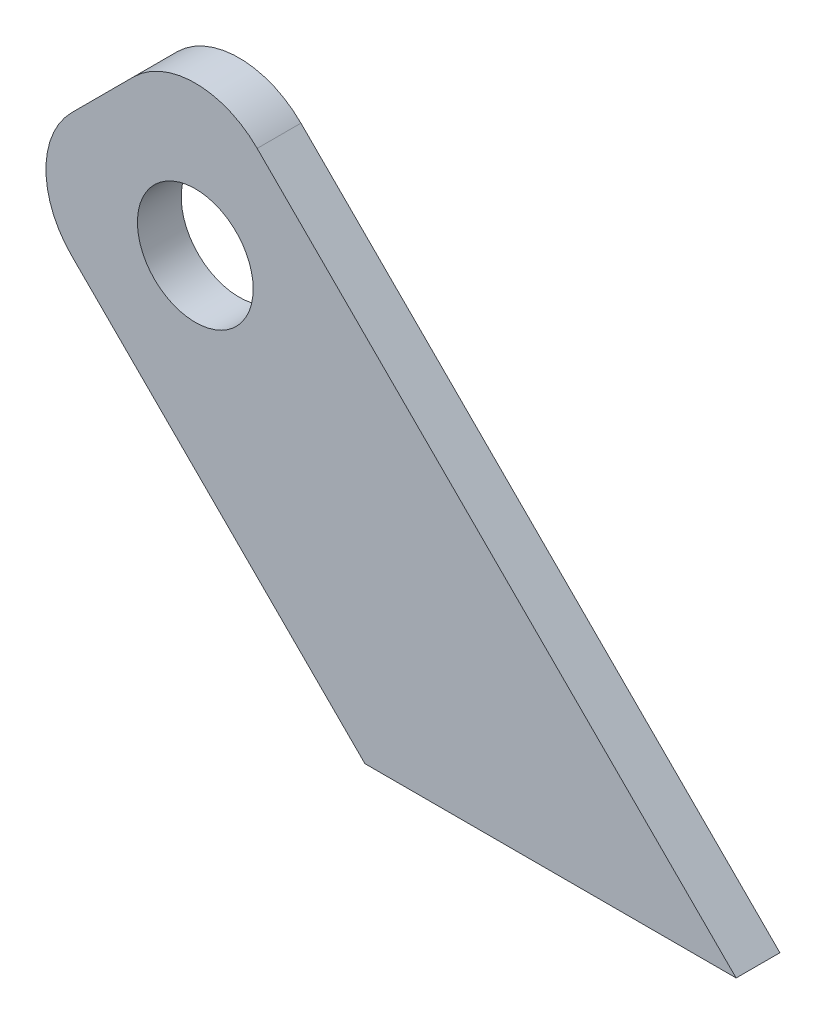
ISO-10303-21;
HEADER;
FILE_DESCRIPTION(('STEP AP214'),'2;1');
FILE_NAME('part.step','',(''),(''),'','','');
FILE_SCHEMA(('AUTOMOTIVE_DESIGN { 1 0 10303 214 1 1 1 1 }'));
ENDSEC;
DATA;
#1=APPLICATION_CONTEXT('core data for automotive mechanical design processes');
#2=APPLICATION_PROTOCOL_DEFINITION('international standard','automotive_design',2000,#1);
#3=PRODUCT_CONTEXT('',#1,'mechanical');
#4=PRODUCT('Part','Part','',(#3));
#5=PRODUCT_RELATED_PRODUCT_CATEGORY('part','',(#4));
#6=PRODUCT_DEFINITION_FORMATION('','',#4);
#7=PRODUCT_DEFINITION_CONTEXT('part definition',#1,'design');
#8=PRODUCT_DEFINITION('design','',#6,#7);
#9=PRODUCT_DEFINITION_SHAPE('','',#8);
#10=(LENGTH_UNIT() NAMED_UNIT(*) SI_UNIT(.MILLI.,.METRE.));
#11=(NAMED_UNIT(*) PLANE_ANGLE_UNIT() SI_UNIT($,.RADIAN.));
#12=(NAMED_UNIT(*) SI_UNIT($,.STERADIAN.) SOLID_ANGLE_UNIT());
#13=UNCERTAINTY_MEASURE_WITH_UNIT(LENGTH_MEASURE(1.E-05),#10,'distance_accuracy_value','');
#14=(GEOMETRIC_REPRESENTATION_CONTEXT(3) GLOBAL_UNCERTAINTY_ASSIGNED_CONTEXT((#13)) GLOBAL_UNIT_ASSIGNED_CONTEXT((#10,
#11,#12)) REPRESENTATION_CONTEXT('',''));
#15=CARTESIAN_POINT('',(0.,0.,0.));
#16=DIRECTION('',(0.,0.,1.));
#17=DIRECTION('',(1.,0.,0.));
#18=AXIS2_PLACEMENT_3D('',#15,#16,#17);
#19=CARTESIAN_POINT('',(33.610044183049,38.0994845362194,-3.175));
#20=DIRECTION('',(0.,0.,1.));
#21=DIRECTION('',(-1.,0.,0.));
#22=AXIS2_PLACEMENT_3D('',#19,#20,#21);
#23=CYLINDRICAL_SURFACE('',#22,6.35);
#24=CARTESIAN_POINT('',(33.610044183049,38.0994845362194,0.));
#25=DIRECTION('',(0.,0.,1.));
#26=DIRECTION('',(1.,0.,0.));
#27=AXIS2_PLACEMENT_3D('',#24,#25,#26);
#28=CIRCLE('',#27,6.35);
#29=CARTESIAN_POINT('',(29.1198730615669,33.6093995370453,0.));
#30=VERTEX_POINT('',#29);
#31=CARTESIAN_POINT('',(29.119959183875,42.5896556577015,0.));
#32=VERTEX_POINT('',#31);
#33=EDGE_CURVE('E137',#30,#32,#28,.F.);
#34=ORIENTED_EDGE('',*,*,#33,.T.);
#35=DIRECTION('',(0.,0.,1.));
#36=VECTOR('',#35,1.);
#37=CARTESIAN_POINT('',(29.119959183875,42.5896556577015,-3.175));
#38=LINE('',#37,#36);
#39=CARTESIAN_POINT('',(29.119959183875,42.5896556577015,-3.175));
#40=VERTEX_POINT('',#39);
#41=EDGE_CURVE('E136',#40,#32,#38,.T.);
#42=ORIENTED_EDGE('',*,*,#41,.F.);
#43=CARTESIAN_POINT('',(33.610044183049,38.0994845362194,-3.175));
#44=DIRECTION('',(0.,0.,1.));
#45=DIRECTION('',(1.,0.,0.));
#46=AXIS2_PLACEMENT_3D('',#43,#44,#45);
#47=CIRCLE('',#46,6.35);
#48=CARTESIAN_POINT('',(29.1198730615669,33.6093995370453,-3.175));
#49=VERTEX_POINT('',#48);
#50=EDGE_CURVE('E155',#49,#40,#47,.F.);
#51=ORIENTED_EDGE('',*,*,#50,.F.);
#52=DIRECTION('',(0.,0.,1.));
#53=VECTOR('',#52,1.);
#54=CARTESIAN_POINT('',(29.1198730615669,33.6093995370453,-3.175));
#55=LINE('',#54,#53);
#56=EDGE_CURVE('E11',#49,#30,#55,.T.);
#57=ORIENTED_EDGE('',*,*,#56,.T.);
#58=EDGE_LOOP('',(#34,#42,#51,#57));
#59=FACE_BOUND('',#58,.T.);
#60=ADVANCED_FACE('F43',(#59),#23,.T.);
#61=CARTESIAN_POINT('',(31.364915561154,31.3643139763043,-3.175));
#62=DIRECTION('',(-0.707113562438127,-0.707099999869934,0.));
#63=DIRECTION('',(0.707099999869934,-0.707113562438127,0.));
#64=AXIS2_PLACEMENT_3D('',#61,#62,#63);
#65=PLANE('',#64);
#66=DIRECTION('',(-0.707099999869934,0.707113562438127,0.));
#67=VECTOR('',#66,1.);
#68=CARTESIAN_POINT('',(31.364915561154,31.3643139763043,0.));
#69=LINE('',#68,#67);
#70=CARTESIAN_POINT('',(40.3449994380201,22.384057856474,0.));
#71=VERTEX_POINT('',#70);
#72=EDGE_CURVE('E140',#71,#30,#69,.T.);
#73=ORIENTED_EDGE('',*,*,#72,.T.);
#74=ORIENTED_EDGE('',*,*,#56,.F.);
#75=DIRECTION('',(-0.707099999869934,0.707113562438127,0.));
#76=VECTOR('',#75,1.);
#77=CARTESIAN_POINT('',(31.364915561154,31.3643139763043,-3.175));
#78=LINE('',#77,#76);
#79=CARTESIAN_POINT('',(40.3449994380201,22.384057856474,-3.175));
#80=VERTEX_POINT('',#79);
#81=EDGE_CURVE('E94',#80,#49,#78,.T.);
#82=ORIENTED_EDGE('',*,*,#81,.F.);
#83=DIRECTION('',(0.,0.,1.));
#84=VECTOR('',#83,1.);
#85=CARTESIAN_POINT('',(40.3449994380201,22.384057856474,-3.175));
#86=LINE('',#85,#84);
#87=EDGE_CURVE('E51',#80,#71,#86,.T.);
#88=ORIENTED_EDGE('',*,*,#87,.T.);
#89=EDGE_LOOP('',(#73,#74,#82,#88));
#90=FACE_BOUND('',#89,.T.);
#91=ADVANCED_FACE('F165',(#90),#65,.T.);
#92=CARTESIAN_POINT('',(31.3641417292227,31.3647433107686,-3.175));
#93=DIRECTION('',(0.707099999869934,0.707113562438127,0.));
#94=DIRECTION('',(-0.707113562438127,0.707099999869934,0.));
#95=AXIS2_PLACEMENT_3D('',#92,#93,#94);
#96=PLANE('',#95);
#97=DIRECTION('',(0.707113562438127,-0.707099999869934,0.));
#98=VECTOR('',#97,1.);
#99=CARTESIAN_POINT('',(31.3641417292227,31.3647433107686,0.));
#100=LINE('',#99,#98);
#101=CARTESIAN_POINT('',(50.4102503478579,12.319,0.));
#102=VERTEX_POINT('',#101);
#103=EDGE_CURVE('E142',#71,#102,#100,.T.);
#104=ORIENTED_EDGE('',*,*,#103,.F.);
#105=ORIENTED_EDGE('',*,*,#87,.F.);
#106=DIRECTION('',(0.707113562438127,-0.707099999869934,0.));
#107=VECTOR('',#106,1.);
#108=CARTESIAN_POINT('',(31.3641417292227,31.3647433107686,-3.175));
#109=LINE('',#108,#107);
#110=CARTESIAN_POINT('',(50.4102503478579,12.319,-3.175));
#111=VERTEX_POINT('',#110);
#112=EDGE_CURVE('E128',#80,#111,#109,.T.);
#113=ORIENTED_EDGE('',*,*,#112,.T.);
#114=DIRECTION('',(0.,0.,1.));
#115=VECTOR('',#114,1.);
#116=CARTESIAN_POINT('',(50.4102503478579,12.319,-3.175));
#117=LINE('',#116,#115);
#118=EDGE_CURVE('E159',#111,#102,#117,.T.);
#119=ORIENTED_EDGE('',*,*,#118,.T.);
#120=EDGE_LOOP('',(#104,#105,#113,#119));
#121=FACE_BOUND('',#120,.T.);
#122=ADVANCED_FACE('F175',(#121),#96,.F.);
#123=CARTESIAN_POINT('',(0.,12.319,-3.175));
#124=DIRECTION('',(0.,1.,0.));
#125=DIRECTION('',(0.,0.,-1.));
#126=AXIS2_PLACEMENT_3D('',#123,#124,#125);
#127=PLANE('',#126);
#128=DIRECTION('',(1.,0.,0.));
#129=VECTOR('',#128,1.);
#130=CARTESIAN_POINT('',(0.,12.319,0.));
#131=LINE('',#130,#129);
#132=CARTESIAN_POINT('',(77.3512770817062,12.319,0.));
#133=VERTEX_POINT('',#132);
#134=EDGE_CURVE('E145',#102,#133,#131,.T.);
#135=ORIENTED_EDGE('',*,*,#134,.F.);
#136=ORIENTED_EDGE('',*,*,#118,.F.);
#137=DIRECTION('',(1.,0.,0.));
#138=VECTOR('',#137,1.);
#139=CARTESIAN_POINT('',(0.,12.319,-3.175));
#140=LINE('',#139,#138);
#141=CARTESIAN_POINT('',(77.3512770817062,12.319,-3.175));
#142=VERTEX_POINT('',#141);
#143=EDGE_CURVE('E126',#111,#142,#140,.T.);
#144=ORIENTED_EDGE('',*,*,#143,.T.);
#145=DIRECTION('',(0.,0.,1.));
#146=VECTOR('',#145,1.);
#147=CARTESIAN_POINT('',(77.3512770817062,12.319,-3.175));
#148=LINE('',#147,#146);
#149=EDGE_CURVE('E120',#142,#133,#148,.T.);
#150=ORIENTED_EDGE('',*,*,#149,.T.);
#151=EDGE_LOOP('',(#135,#136,#144,#150));
#152=FACE_BOUND('',#151,.T.);
#153=ADVANCED_FACE('F178',(#152),#127,.F.);
#154=CARTESIAN_POINT('',(44.8343967267449,44.8352566752149,-3.175));
#155=DIRECTION('',(0.707099999869934,0.707113562438128,0.));
#156=DIRECTION('',(-0.707113562438128,0.707099999869934,0.));
#157=AXIS2_PLACEMENT_3D('',#154,#155,#156);
#158=PLANE('',#157);
#159=DIRECTION('',(0.707113562438128,-0.707099999869934,0.));
#160=VECTOR('',#159,1.);
#161=CARTESIAN_POINT('',(44.8343967267449,44.8352566752149,0.));
#162=LINE('',#161,#160);
#163=CARTESIAN_POINT('',(42.5900849991741,47.079525356474,0.));
#164=VERTEX_POINT('',#163);
#165=EDGE_CURVE('E148',#164,#133,#162,.T.);
#166=ORIENTED_EDGE('',*,*,#165,.T.);
#167=ORIENTED_EDGE('',*,*,#149,.F.);
#168=DIRECTION('',(0.707113562438128,-0.707099999869934,0.));
#169=VECTOR('',#168,1.);
#170=CARTESIAN_POINT('',(44.8343967267449,44.8352566752149,-3.175));
#171=LINE('',#170,#169);
#172=CARTESIAN_POINT('',(42.5900849991741,47.079525356474,-3.175));
#173=VERTEX_POINT('',#172);
#174=EDGE_CURVE('E110',#173,#142,#171,.T.);
#175=ORIENTED_EDGE('',*,*,#174,.F.);
#176=DIRECTION('',(0.,0.,1.));
#177=VECTOR('',#176,1.);
#178=CARTESIAN_POINT('',(42.5900849991741,47.079525356474,-3.175));
#179=LINE('',#178,#177);
#180=EDGE_CURVE('E115',#173,#164,#179,.T.);
#181=ORIENTED_EDGE('',*,*,#180,.T.);
#182=EDGE_LOOP('',(#166,#167,#175,#181));
#183=FACE_BOUND('',#182,.T.);
#184=ADVANCED_FACE('F123',(#183),#158,.T.);
#185=CARTESIAN_POINT('',(38.1,42.5893542349919,-3.175));
#186=DIRECTION('',(0.,0.,1.));
#187=DIRECTION('',(-1.,0.,0.));
#188=AXIS2_PLACEMENT_3D('',#185,#186,#187);
#189=CYLINDRICAL_SURFACE('',#188,6.35);
#190=CARTESIAN_POINT('',(38.1,42.5893542349919,0.));
#191=DIRECTION('',(0.,0.,1.));
#192=DIRECTION('',(1.,0.,0.));
#193=AXIS2_PLACEMENT_3D('',#190,#191,#192);
#194=CIRCLE('',#193,6.35);
#195=CARTESIAN_POINT('',(33.6099150008259,47.079525356474,0.));
#196=VERTEX_POINT('',#195);
#197=EDGE_CURVE('E117',#164,#196,#194,.T.);
#198=ORIENTED_EDGE('',*,*,#197,.F.);
#199=ORIENTED_EDGE('',*,*,#180,.F.);
#200=CARTESIAN_POINT('',(38.1,42.5893542349919,-3.175));
#201=DIRECTION('',(0.,0.,1.));
#202=DIRECTION('',(1.,0.,0.));
#203=AXIS2_PLACEMENT_3D('',#200,#201,#202);
#204=CIRCLE('',#203,6.35);
#205=CARTESIAN_POINT('',(33.6099150008259,47.079525356474,-3.175));
#206=VERTEX_POINT('',#205);
#207=EDGE_CURVE('E105',#173,#206,#204,.T.);
#208=ORIENTED_EDGE('',*,*,#207,.T.);
#209=DIRECTION('',(0.,0.,1.));
#210=VECTOR('',#209,1.);
#211=CARTESIAN_POINT('',(33.6099150008259,47.079525356474,-3.175));
#212=LINE('',#211,#210);
#213=EDGE_CURVE('E121',#206,#196,#212,.T.);
#214=ORIENTED_EDGE('',*,*,#213,.T.);
#215=EDGE_LOOP('',(#198,#199,#208,#214));
#216=FACE_BOUND('',#215,.T.);
#217=ADVANCED_FACE('F116',(#216),#189,.T.);
#218=CARTESIAN_POINT('',(-6.73512749876113,6.73525668222317,-3.175));
#219=DIRECTION('',(-0.707099999869934,0.707113562438127,0.));
#220=DIRECTION('',(-0.707113562438127,-0.707099999869934,0.));
#221=AXIS2_PLACEMENT_3D('',#218,#219,#220);
#222=PLANE('',#221);
#223=DIRECTION('',(0.707113562438127,0.707099999869934,0.));
#224=VECTOR('',#223,1.);
#225=CARTESIAN_POINT('',(-6.73512749876113,6.73525668222317,0.));
#226=LINE('',#225,#224);
#227=EDGE_CURVE('E82',#32,#196,#226,.T.);
#228=ORIENTED_EDGE('',*,*,#227,.T.);
#229=ORIENTED_EDGE('',*,*,#213,.F.);
#230=DIRECTION('',(0.707113562438127,0.707099999869934,0.));
#231=VECTOR('',#230,1.);
#232=CARTESIAN_POINT('',(-6.73512749876113,6.73525668222317,-3.175));
#233=LINE('',#232,#231);
#234=EDGE_CURVE('E59',#40,#206,#233,.T.);
#235=ORIENTED_EDGE('',*,*,#234,.F.);
#236=ORIENTED_EDGE('',*,*,#41,.T.);
#237=EDGE_LOOP('',(#228,#229,#235,#236));
#238=FACE_BOUND('',#237,.T.);
#239=ADVANCED_FACE('F219',(#238),#222,.T.);
#240=CARTESIAN_POINT('',(38.1,38.0992692349919,-3.175));
#241=DIRECTION('',(0.,0.,1.));
#242=DIRECTION('',(-1.,0.,0.));
#243=AXIS2_PLACEMENT_3D('',#240,#241,#242);
#244=CYLINDRICAL_SURFACE('',#243,4.19988999999999);
#245=CARTESIAN_POINT('',(38.1,38.0992692349919,-3.175));
#246=DIRECTION('',(0.,0.,1.));
#247=DIRECTION('',(1.,0.,0.));
#248=AXIS2_PLACEMENT_3D('',#245,#246,#247);
#249=CIRCLE('',#248,4.19988999999999);
#250=CARTESIAN_POINT('',(42.29989,38.0992692349919,-3.175));
#251=VERTEX_POINT('',#250);
#252=EDGE_CURVE('E133',#251,#251,#249,.T.);
#253=ORIENTED_EDGE('',*,*,#252,.F.);
#254=EDGE_LOOP('',(#253));
#255=FACE_BOUND('',#254,.T.);
#256=CARTESIAN_POINT('',(38.1,38.0992692349919,0.));
#257=DIRECTION('',(0.,0.,1.));
#258=DIRECTION('',(1.,0.,0.));
#259=AXIS2_PLACEMENT_3D('',#256,#257,#258);
#260=CIRCLE('',#259,4.19988999999999);
#261=CARTESIAN_POINT('',(42.29989,38.0992692349919,0.));
#262=VERTEX_POINT('',#261);
#263=EDGE_CURVE('E152',#262,#262,#260,.T.);
#264=ORIENTED_EDGE('',*,*,#263,.T.);
#265=EDGE_LOOP('',(#264));
#266=FACE_BOUND('',#265,.T.);
#267=ADVANCED_FACE('F230',(#255,#266),#244,.F.);
#268=CARTESIAN_POINT('',(0.,0.,-3.175));
#269=DIRECTION('',(0.,0.,-1.));
#270=DIRECTION('',(1.,0.,0.));
#271=AXIS2_PLACEMENT_3D('',#268,#269,#270);
#272=PLANE('',#271);
#273=ORIENTED_EDGE('',*,*,#50,.T.);
#274=ORIENTED_EDGE('',*,*,#234,.T.);
#275=ORIENTED_EDGE('',*,*,#207,.F.);
#276=ORIENTED_EDGE('',*,*,#174,.T.);
#277=ORIENTED_EDGE('',*,*,#143,.F.);
#278=ORIENTED_EDGE('',*,*,#112,.F.);
#279=ORIENTED_EDGE('',*,*,#81,.T.);
#280=EDGE_LOOP('',(#273,#274,#275,#276,#277,#278,#279));
#281=FACE_BOUND('',#280,.T.);
#282=ORIENTED_EDGE('',*,*,#252,.T.);
#283=EDGE_LOOP('',(#282));
#284=FACE_BOUND('',#283,.T.);
#285=ADVANCED_FACE('F107',(#281,#284),#272,.T.);
#286=CARTESIAN_POINT('',(0.,0.,0.));
#287=DIRECTION('',(0.,0.,-1.));
#288=DIRECTION('',(1.,0.,0.));
#289=AXIS2_PLACEMENT_3D('',#286,#287,#288);
#290=PLANE('',#289);
#291=ORIENTED_EDGE('',*,*,#33,.F.);
#292=ORIENTED_EDGE('',*,*,#72,.F.);
#293=ORIENTED_EDGE('',*,*,#103,.T.);
#294=ORIENTED_EDGE('',*,*,#134,.T.);
#295=ORIENTED_EDGE('',*,*,#165,.F.);
#296=ORIENTED_EDGE('',*,*,#197,.T.);
#297=ORIENTED_EDGE('',*,*,#227,.F.);
#298=EDGE_LOOP('',(#291,#292,#293,#294,#295,#296,#297));
#299=FACE_BOUND('',#298,.T.);
#300=ORIENTED_EDGE('',*,*,#263,.F.);
#301=EDGE_LOOP('',(#300));
#302=FACE_BOUND('',#301,.T.);
#303=ADVANCED_FACE('F168',(#299,#302),#290,.F.);
#304=CLOSED_SHELL('',(#60,#91,#122,#153,#184,#217,#239,#267,#285,#303));
#305=MANIFOLD_SOLID_BREP('B2',#304);
#306=ADVANCED_BREP_SHAPE_REPRESENTATION('',(#18,#305),#14);
#307=SHAPE_DEFINITION_REPRESENTATION(#9,#306);
ENDSEC;
END-ISO-10303-21;
